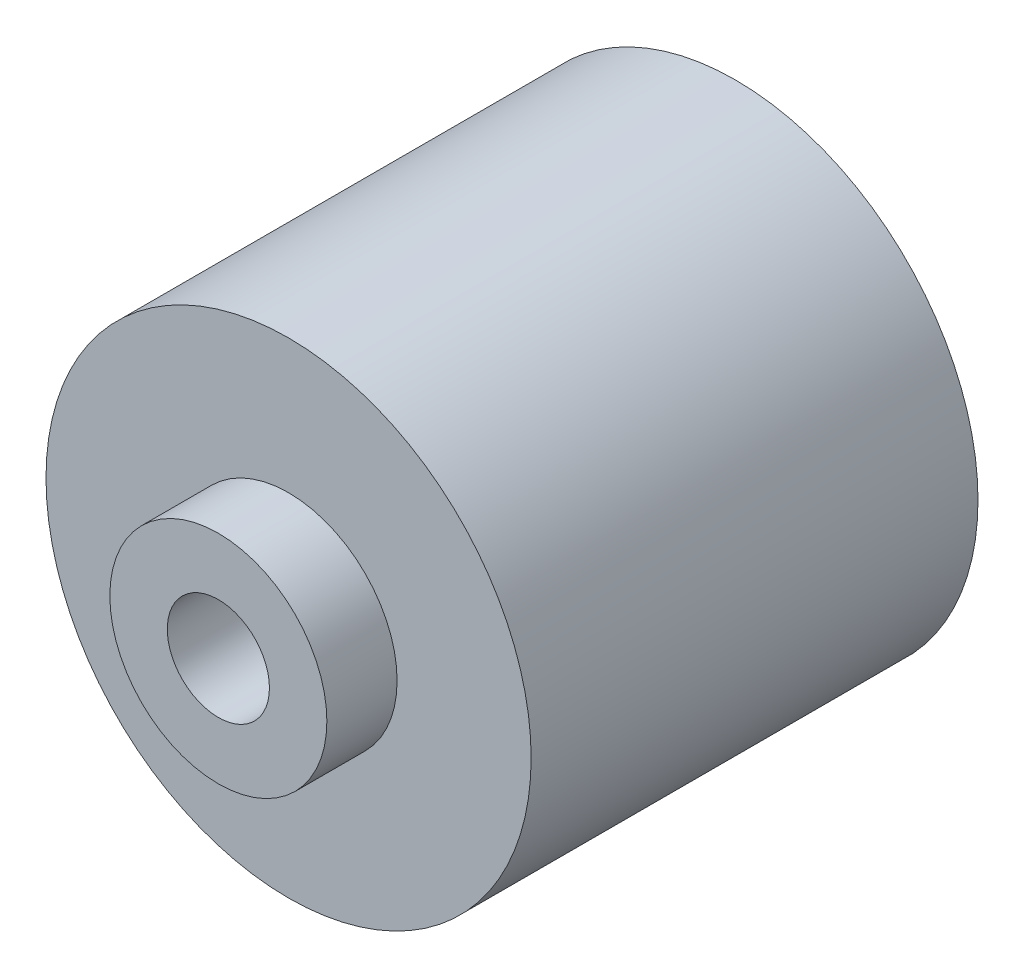
ISO-10303-21;
HEADER;
FILE_DESCRIPTION(('STEP AP214'),'2;1');
FILE_NAME('part.step','',(''),(''),'','','');
FILE_SCHEMA(('AUTOMOTIVE_DESIGN { 1 0 10303 214 1 1 1 1 }'));
ENDSEC;
DATA;
#1=APPLICATION_CONTEXT('core data for automotive mechanical design processes');
#2=APPLICATION_PROTOCOL_DEFINITION('international standard','automotive_design',2000,#1);
#3=PRODUCT_CONTEXT('',#1,'mechanical');
#4=PRODUCT('Part','Part','',(#3));
#5=PRODUCT_RELATED_PRODUCT_CATEGORY('part','',(#4));
#6=PRODUCT_DEFINITION_FORMATION('','',#4);
#7=PRODUCT_DEFINITION_CONTEXT('part definition',#1,'design');
#8=PRODUCT_DEFINITION('design','',#6,#7);
#9=PRODUCT_DEFINITION_SHAPE('','',#8);
#10=(LENGTH_UNIT() NAMED_UNIT(*) SI_UNIT(.MILLI.,.METRE.));
#11=(NAMED_UNIT(*) PLANE_ANGLE_UNIT() SI_UNIT($,.RADIAN.));
#12=(NAMED_UNIT(*) SI_UNIT($,.STERADIAN.) SOLID_ANGLE_UNIT());
#13=UNCERTAINTY_MEASURE_WITH_UNIT(LENGTH_MEASURE(1.E-05),#10,'distance_accuracy_value','');
#14=(GEOMETRIC_REPRESENTATION_CONTEXT(3) GLOBAL_UNCERTAINTY_ASSIGNED_CONTEXT((#13)) GLOBAL_UNIT_ASSIGNED_CONTEXT((#10,
#11,#12)) REPRESENTATION_CONTEXT('',''));
#15=CARTESIAN_POINT('',(0.,0.,0.));
#16=DIRECTION('',(0.,0.,1.));
#17=DIRECTION('',(1.,0.,0.));
#18=AXIS2_PLACEMENT_3D('',#15,#16,#17);
#19=CARTESIAN_POINT('',(0.,0.,35.));
#20=DIRECTION('',(0.,0.,-1.));
#21=DIRECTION('',(-1.,0.,0.));
#22=AXIS2_PLACEMENT_3D('',#19,#20,#21);
#23=CYLINDRICAL_SURFACE('',#22,19.);
#24=CARTESIAN_POINT('',(0.,0.,35.));
#25=DIRECTION('',(0.,0.,1.));
#26=DIRECTION('',(1.,0.,0.));
#27=AXIS2_PLACEMENT_3D('',#24,#25,#26);
#28=CIRCLE('',#27,19.);
#29=CARTESIAN_POINT('',(19.,0.,35.));
#30=VERTEX_POINT('',#29);
#31=EDGE_CURVE('E10',#30,#30,#28,.T.);
#32=ORIENTED_EDGE('',*,*,#31,.F.);
#33=EDGE_LOOP('',(#32));
#34=FACE_BOUND('',#33,.T.);
#35=CARTESIAN_POINT('',(0.,0.,0.));
#36=DIRECTION('',(0.,0.,1.));
#37=DIRECTION('',(1.,0.,0.));
#38=AXIS2_PLACEMENT_3D('',#35,#36,#37);
#39=CIRCLE('',#38,19.);
#40=CARTESIAN_POINT('',(19.,0.,0.));
#41=VERTEX_POINT('',#40);
#42=EDGE_CURVE('E33',#41,#41,#39,.T.);
#43=ORIENTED_EDGE('',*,*,#42,.T.);
#44=EDGE_LOOP('',(#43));
#45=FACE_BOUND('',#44,.T.);
#46=ADVANCED_FACE('F30',(#34,#45),#23,.T.);
#47=CARTESIAN_POINT('',(0.,0.,35.));
#48=DIRECTION('',(0.,0.,1.));
#49=DIRECTION('',(1.,0.,0.));
#50=AXIS2_PLACEMENT_3D('',#47,#48,#49);
#51=PLANE('',#50);
#52=CARTESIAN_POINT('',(0.,0.,35.));
#53=DIRECTION('',(0.,0.,1.));
#54=DIRECTION('',(1.,0.,0.));
#55=AXIS2_PLACEMENT_3D('',#52,#53,#54);
#56=CIRCLE('',#55,8.5);
#57=CARTESIAN_POINT('',(8.5,0.,35.));
#58=VERTEX_POINT('',#57);
#59=EDGE_CURVE('E42',#58,#58,#56,.T.);
#60=ORIENTED_EDGE('',*,*,#59,.F.);
#61=EDGE_LOOP('',(#60));
#62=FACE_BOUND('',#61,.T.);
#63=ORIENTED_EDGE('',*,*,#31,.T.);
#64=EDGE_LOOP('',(#63));
#65=FACE_BOUND('',#64,.T.);
#66=ADVANCED_FACE('F75',(#62,#65),#51,.T.);
#67=CARTESIAN_POINT('',(0.,0.,0.));
#68=DIRECTION('',(0.,0.,1.));
#69=DIRECTION('',(1.,0.,0.));
#70=AXIS2_PLACEMENT_3D('',#67,#68,#69);
#71=PLANE('',#70);
#72=ORIENTED_EDGE('',*,*,#42,.F.);
#73=EDGE_LOOP('',(#72));
#74=FACE_BOUND('',#73,.T.);
#75=ADVANCED_FACE('F71',(#74),#71,.F.);
#76=CARTESIAN_POINT('',(0.,0.,40.5));
#77=DIRECTION('',(0.,0.,-1.));
#78=DIRECTION('',(-1.,0.,0.));
#79=AXIS2_PLACEMENT_3D('',#76,#77,#78);
#80=CYLINDRICAL_SURFACE('',#79,8.5);
#81=CARTESIAN_POINT('',(0.,0.,40.5));
#82=DIRECTION('',(0.,0.,1.));
#83=DIRECTION('',(1.,0.,0.));
#84=AXIS2_PLACEMENT_3D('',#81,#82,#83);
#85=CIRCLE('',#84,8.5);
#86=CARTESIAN_POINT('',(8.5,0.,40.5));
#87=VERTEX_POINT('',#86);
#88=EDGE_CURVE('E40',#87,#87,#85,.T.);
#89=ORIENTED_EDGE('',*,*,#88,.F.);
#90=EDGE_LOOP('',(#89));
#91=FACE_BOUND('',#90,.T.);
#92=ORIENTED_EDGE('',*,*,#59,.T.);
#93=EDGE_LOOP('',(#92));
#94=FACE_BOUND('',#93,.T.);
#95=ADVANCED_FACE('F65',(#91,#94),#80,.T.);
#96=CARTESIAN_POINT('',(0.,0.,40.5));
#97=DIRECTION('',(0.,0.,1.));
#98=DIRECTION('',(1.,0.,0.));
#99=AXIS2_PLACEMENT_3D('',#96,#97,#98);
#100=PLANE('',#99);
#101=CARTESIAN_POINT('',(0.,0.,40.5));
#102=DIRECTION('',(0.,0.,1.));
#103=DIRECTION('',(1.,0.,0.));
#104=AXIS2_PLACEMENT_3D('',#101,#102,#103);
#105=CIRCLE('',#104,4.);
#106=CARTESIAN_POINT('',(4.,0.,40.5));
#107=VERTEX_POINT('',#106);
#108=EDGE_CURVE('E48',#107,#107,#105,.T.);
#109=ORIENTED_EDGE('',*,*,#108,.F.);
#110=EDGE_LOOP('',(#109));
#111=FACE_BOUND('',#110,.T.);
#112=ORIENTED_EDGE('',*,*,#88,.T.);
#113=EDGE_LOOP('',(#112));
#114=FACE_BOUND('',#113,.T.);
#115=ADVANCED_FACE('F59',(#111,#114),#100,.T.);
#116=CARTESIAN_POINT('',(0.,0.,30.5));
#117=DIRECTION('',(0.,0.,1.));
#118=DIRECTION('',(1.,0.,0.));
#119=AXIS2_PLACEMENT_3D('',#116,#117,#118);
#120=CYLINDRICAL_SURFACE('',#119,4.);
#121=CARTESIAN_POINT('',(0.,0.,30.5));
#122=DIRECTION('',(0.,0.,1.));
#123=DIRECTION('',(1.,0.,0.));
#124=AXIS2_PLACEMENT_3D('',#121,#122,#123);
#125=CIRCLE('',#124,4.);
#126=CARTESIAN_POINT('',(4.,0.,30.5));
#127=VERTEX_POINT('',#126);
#128=EDGE_CURVE('E45',#127,#127,#125,.T.);
#129=ORIENTED_EDGE('',*,*,#128,.F.);
#130=EDGE_LOOP('',(#129));
#131=FACE_BOUND('',#130,.T.);
#132=ORIENTED_EDGE('',*,*,#108,.T.);
#133=EDGE_LOOP('',(#132));
#134=FACE_BOUND('',#133,.T.);
#135=ADVANCED_FACE('F56',(#131,#134),#120,.F.);
#136=CARTESIAN_POINT('',(0.,0.,30.5));
#137=DIRECTION('',(0.,0.,1.));
#138=DIRECTION('',(1.,0.,0.));
#139=AXIS2_PLACEMENT_3D('',#136,#137,#138);
#140=PLANE('',#139);
#141=ORIENTED_EDGE('',*,*,#128,.T.);
#142=EDGE_LOOP('',(#141));
#143=FACE_BOUND('',#142,.T.);
#144=ADVANCED_FACE('F54',(#143),#140,.T.);
#145=CLOSED_SHELL('',(#46,#66,#75,#95,#115,#135,#144));
#146=MANIFOLD_SOLID_BREP('B2',#145);
#147=ADVANCED_BREP_SHAPE_REPRESENTATION('',(#18,#146),#14);
#148=SHAPE_DEFINITION_REPRESENTATION(#9,#147);
ENDSEC;
END-ISO-10303-21;
